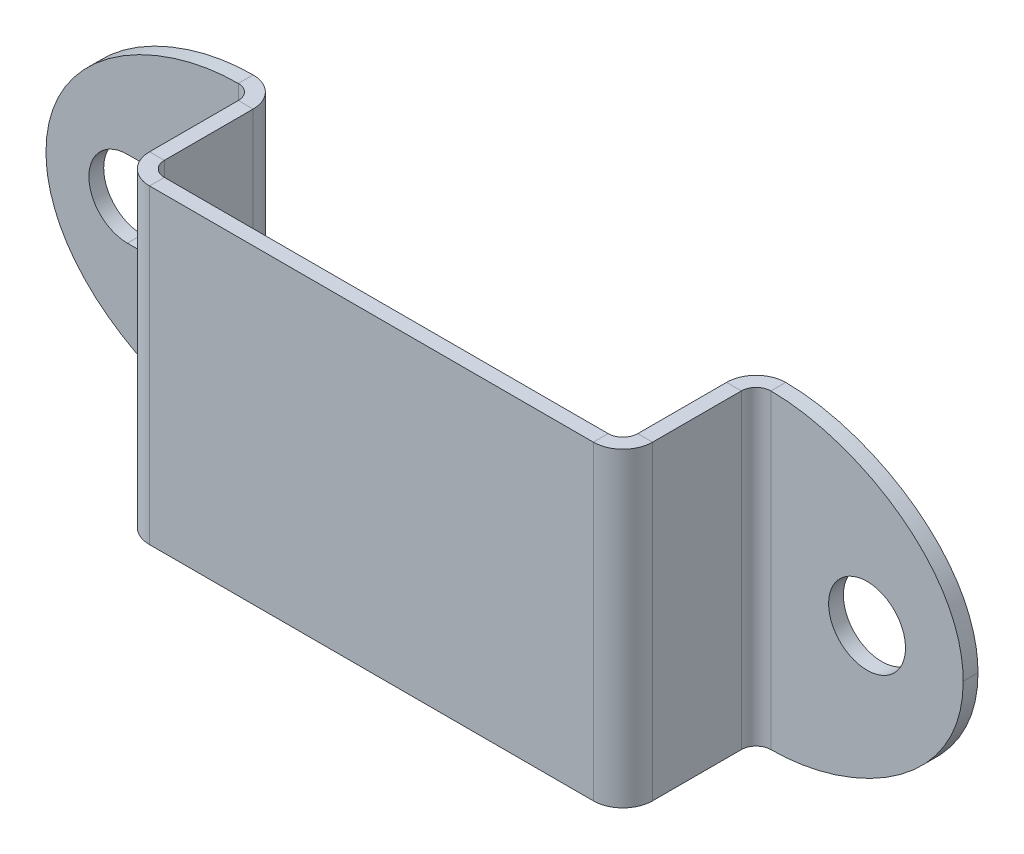
ISO-10303-21;
HEADER;
FILE_DESCRIPTION(('STEP AP214'),'2;1');
FILE_NAME('part.step','',(''),(''),'','','');
FILE_SCHEMA(('AUTOMOTIVE_DESIGN { 1 0 10303 214 1 1 1 1 }'));
ENDSEC;
DATA;
#1=APPLICATION_CONTEXT('core data for automotive mechanical design processes');
#2=APPLICATION_PROTOCOL_DEFINITION('international standard','automotive_design',2000,#1);
#3=PRODUCT_CONTEXT('',#1,'mechanical');
#4=PRODUCT('Part','Part','',(#3));
#5=PRODUCT_RELATED_PRODUCT_CATEGORY('part','',(#4));
#6=PRODUCT_DEFINITION_FORMATION('','',#4);
#7=PRODUCT_DEFINITION_CONTEXT('part definition',#1,'design');
#8=PRODUCT_DEFINITION('design','',#6,#7);
#9=PRODUCT_DEFINITION_SHAPE('','',#8);
#10=(LENGTH_UNIT() NAMED_UNIT(*) SI_UNIT(.MILLI.,.METRE.));
#11=(NAMED_UNIT(*) PLANE_ANGLE_UNIT() SI_UNIT($,.RADIAN.));
#12=(NAMED_UNIT(*) SI_UNIT($,.STERADIAN.) SOLID_ANGLE_UNIT());
#13=UNCERTAINTY_MEASURE_WITH_UNIT(LENGTH_MEASURE(1.E-05),#10,'distance_accuracy_value','');
#14=(GEOMETRIC_REPRESENTATION_CONTEXT(3) GLOBAL_UNCERTAINTY_ASSIGNED_CONTEXT((#13)) GLOBAL_UNIT_ASSIGNED_CONTEXT((#10,
#11,#12)) REPRESENTATION_CONTEXT('',''));
#15=CARTESIAN_POINT('',(0.,0.,0.));
#16=DIRECTION('',(0.,0.,1.));
#17=DIRECTION('',(1.,0.,0.));
#18=AXIS2_PLACEMENT_3D('',#15,#16,#17);
#19=CARTESIAN_POINT('',(16.,21.,1.));
#20=DIRECTION('',(0.,0.,-1.));
#21=DIRECTION('',(-1.,0.,0.));
#22=AXIS2_PLACEMENT_3D('',#19,#20,#21);
#23=PLANE('',#22);
#24=CARTESIAN_POINT('',(24.5,10.5,1.00000000000001));
#25=DIRECTION('',(0.,0.,1.));
#26=DIRECTION('',(-1.,0.,0.));
#27=AXIS2_PLACEMENT_3D('',#24,#25,#26);
#28=CIRCLE('',#27,2.6);
#29=CARTESIAN_POINT('',(21.9,10.5,1.00000000000001));
#30=VERTEX_POINT('',#29);
#31=EDGE_CURVE('E401',#30,#30,#28,.T.);
#32=ORIENTED_EDGE('',*,*,#31,.F.);
#33=EDGE_LOOP('',(#32));
#34=FACE_BOUND('',#33,.T.);
#35=CARTESIAN_POINT('',(18.,21.,1.00000000000001));
#36=CARTESIAN_POINT('',(23.8406079071876,21.,1.00000000000001));
#37=CARTESIAN_POINT('',(31.,16.8315231890879,1.00000000000001));
#38=CARTESIAN_POINT('',(31.,10.5,1.00000000000001));
#39=B_SPLINE_CURVE_WITH_KNOTS('',3,(#35,#36,#37,#38),.UNSPECIFIED.,.F.,.F.,(4,4),(0.,1.),.UNSPECIFIED.);
#40=CARTESIAN_POINT('',(18.,21.,1.00000000000001));
#41=VERTEX_POINT('',#40);
#42=CARTESIAN_POINT('',(31.,10.5,1.00000000000001));
#43=VERTEX_POINT('',#42);
#44=EDGE_CURVE('E202',#41,#43,#39,.T.);
#45=ORIENTED_EDGE('',*,*,#44,.F.);
#46=DIRECTION('',(0.,-1.,0.));
#47=VECTOR('',#46,1.);
#48=CARTESIAN_POINT('',(18.,21.,0.999999999999999));
#49=LINE('',#48,#47);
#50=CARTESIAN_POINT('',(18.,0.,0.999999999999999));
#51=VERTEX_POINT('',#50);
#52=EDGE_CURVE('E217',#41,#51,#49,.T.);
#53=ORIENTED_EDGE('',*,*,#52,.T.);
#54=CARTESIAN_POINT('',(31.,10.5,1.00000000000001));
#55=CARTESIAN_POINT('',(31.,4.16847681091213,1.00000000000001));
#56=CARTESIAN_POINT('',(23.8406079071876,0.,1.00000000000001));
#57=CARTESIAN_POINT('',(18.,0.,1.00000000000001));
#58=B_SPLINE_CURVE_WITH_KNOTS('',3,(#54,#55,#56,#57),.UNSPECIFIED.,.F.,.F.,(4,4),(0.,1.),.UNSPECIFIED.);
#59=EDGE_CURVE('E218',#43,#51,#58,.T.);
#60=ORIENTED_EDGE('',*,*,#59,.F.);
#61=EDGE_LOOP('',(#45,#53,#60));
#62=FACE_BOUND('',#61,.T.);
#63=ADVANCED_FACE('F52',(#34,#62),#23,.F.);
#64=CARTESIAN_POINT('',(16.,21.,0.));
#65=DIRECTION('',(0.,0.,-1.));
#66=DIRECTION('',(-1.,0.,0.));
#67=AXIS2_PLACEMENT_3D('',#64,#65,#66);
#68=PLANE('',#67);
#69=CARTESIAN_POINT('',(24.5,10.5,0.));
#70=DIRECTION('',(0.,0.,1.));
#71=DIRECTION('',(-1.,0.,0.));
#72=AXIS2_PLACEMENT_3D('',#69,#70,#71);
#73=CIRCLE('',#72,2.6);
#74=CARTESIAN_POINT('',(21.9,10.5,0.));
#75=VERTEX_POINT('',#74);
#76=EDGE_CURVE('E356',#75,#75,#73,.T.);
#77=ORIENTED_EDGE('',*,*,#76,.T.);
#78=EDGE_LOOP('',(#77));
#79=FACE_BOUND('',#78,.T.);
#80=DIRECTION('',(0.,-1.,0.));
#81=VECTOR('',#80,1.);
#82=CARTESIAN_POINT('',(18.,21.,0.));
#83=LINE('',#82,#81);
#84=CARTESIAN_POINT('',(18.,21.,0.));
#85=VERTEX_POINT('',#84);
#86=CARTESIAN_POINT('',(18.,0.,0.));
#87=VERTEX_POINT('',#86);
#88=EDGE_CURVE('E277',#85,#87,#83,.T.);
#89=ORIENTED_EDGE('',*,*,#88,.F.);
#90=CARTESIAN_POINT('',(18.,21.,0.));
#91=CARTESIAN_POINT('',(23.8406079071876,21.,0.));
#92=CARTESIAN_POINT('',(31.,16.8315231890879,0.));
#93=CARTESIAN_POINT('',(31.,10.5,0.));
#94=B_SPLINE_CURVE_WITH_KNOTS('',3,(#90,#91,#92,#93),.UNSPECIFIED.,.F.,.F.,(4,4),(0.,1.),.UNSPECIFIED.);
#95=CARTESIAN_POINT('',(31.,10.5,0.));
#96=VERTEX_POINT('',#95);
#97=EDGE_CURVE('E205',#85,#96,#94,.T.);
#98=ORIENTED_EDGE('',*,*,#97,.T.);
#99=CARTESIAN_POINT('',(31.,10.5,0.));
#100=CARTESIAN_POINT('',(31.,4.16847681091213,0.));
#101=CARTESIAN_POINT('',(23.8406079071876,0.,0.));
#102=CARTESIAN_POINT('',(18.,0.,0.));
#103=B_SPLINE_CURVE_WITH_KNOTS('',3,(#99,#100,#101,#102),.UNSPECIFIED.,.F.,.F.,(4,4),(0.,1.),.UNSPECIFIED.);
#104=EDGE_CURVE('E569',#96,#87,#103,.T.);
#105=ORIENTED_EDGE('',*,*,#104,.T.);
#106=EDGE_LOOP('',(#89,#98,#105));
#107=FACE_BOUND('',#106,.T.);
#108=ADVANCED_FACE('F478',(#79,#107),#68,.T.);
#109=CARTESIAN_POINT('',(-31.,21.,0.));
#110=DIRECTION('',(0.,0.,-1.));
#111=DIRECTION('',(-1.,0.,0.));
#112=AXIS2_PLACEMENT_3D('',#109,#110,#111);
#113=PLANE('',#112);
#114=CARTESIAN_POINT('',(-23.5,10.5,0.));
#115=DIRECTION('',(0.,0.,1.));
#116=DIRECTION('',(1.,0.,0.));
#117=AXIS2_PLACEMENT_3D('',#114,#115,#116);
#118=CIRCLE('',#117,2.6);
#119=CARTESIAN_POINT('',(-23.5,7.9,0.));
#120=VERTEX_POINT('',#119);
#121=CARTESIAN_POINT('',(-23.5,13.1,0.));
#122=VERTEX_POINT('',#121);
#123=EDGE_CURVE('E641',#120,#122,#118,.T.);
#124=ORIENTED_EDGE('',*,*,#123,.T.);
#125=DIRECTION('',(-1.,0.,0.));
#126=VECTOR('',#125,1.);
#127=CARTESIAN_POINT('',(-23.5,13.1,0.));
#128=LINE('',#127,#126);
#129=CARTESIAN_POINT('',(-25.5,13.1,0.));
#130=VERTEX_POINT('',#129);
#131=EDGE_CURVE('E644',#122,#130,#128,.T.);
#132=ORIENTED_EDGE('',*,*,#131,.T.);
#133=CARTESIAN_POINT('',(-25.5,10.5,0.));
#134=DIRECTION('',(0.,0.,1.));
#135=DIRECTION('',(1.,0.,0.));
#136=AXIS2_PLACEMENT_3D('',#133,#134,#135);
#137=CIRCLE('',#136,2.6);
#138=CARTESIAN_POINT('',(-25.5,7.9,0.));
#139=VERTEX_POINT('',#138);
#140=EDGE_CURVE('E67',#130,#139,#137,.T.);
#141=ORIENTED_EDGE('',*,*,#140,.T.);
#142=DIRECTION('',(1.,0.,0.));
#143=VECTOR('',#142,1.);
#144=CARTESIAN_POINT('',(-23.5,7.9,0.));
#145=LINE('',#144,#143);
#146=EDGE_CURVE('E649',#139,#120,#145,.T.);
#147=ORIENTED_EDGE('',*,*,#146,.T.);
#148=EDGE_LOOP('',(#124,#132,#141,#147));
#149=FACE_BOUND('',#148,.T.);
#150=CARTESIAN_POINT('',(-18.,0.,0.));
#151=CARTESIAN_POINT('',(-23.8406079071876,0.,0.));
#152=CARTESIAN_POINT('',(-31.,4.16847681091213,0.));
#153=CARTESIAN_POINT('',(-31.,10.5,0.));
#154=B_SPLINE_CURVE_WITH_KNOTS('',3,(#150,#151,#152,#153),.UNSPECIFIED.,.F.,.F.,(4,4),(0.,1.),.UNSPECIFIED.);
#155=CARTESIAN_POINT('',(-18.,0.,0.));
#156=VERTEX_POINT('',#155);
#157=CARTESIAN_POINT('',(-31.,10.5,0.));
#158=VERTEX_POINT('',#157);
#159=EDGE_CURVE('E320',#156,#158,#154,.T.);
#160=ORIENTED_EDGE('',*,*,#159,.T.);
#161=CARTESIAN_POINT('',(-31.,10.5,0.));
#162=CARTESIAN_POINT('',(-31.,16.8315231890879,0.));
#163=CARTESIAN_POINT('',(-23.8406079071876,21.,0.));
#164=CARTESIAN_POINT('',(-18.,21.,0.));
#165=B_SPLINE_CURVE_WITH_KNOTS('',3,(#161,#162,#163,#164),.UNSPECIFIED.,.F.,.F.,(4,4),(0.,1.),.UNSPECIFIED.);
#166=CARTESIAN_POINT('',(-18.,21.,0.));
#167=VERTEX_POINT('',#166);
#168=EDGE_CURVE('E307',#158,#167,#165,.T.);
#169=ORIENTED_EDGE('',*,*,#168,.T.);
#170=DIRECTION('',(0.,-1.,0.));
#171=VECTOR('',#170,1.);
#172=CARTESIAN_POINT('',(-18.,21.,0.));
#173=LINE('',#172,#171);
#174=EDGE_CURVE('E256',#167,#156,#173,.T.);
#175=ORIENTED_EDGE('',*,*,#174,.T.);
#176=EDGE_LOOP('',(#160,#169,#175));
#177=FACE_BOUND('',#176,.T.);
#178=ADVANCED_FACE('F318',(#149,#177),#113,.T.);
#179=CARTESIAN_POINT('',(-31.,21.,1.));
#180=DIRECTION('',(0.,0.,-1.));
#181=DIRECTION('',(-1.,0.,0.));
#182=AXIS2_PLACEMENT_3D('',#179,#180,#181);
#183=PLANE('',#182);
#184=DIRECTION('',(-1.,0.,0.));
#185=VECTOR('',#184,1.);
#186=CARTESIAN_POINT('',(-23.5,13.1,1.00000000000001));
#187=LINE('',#186,#185);
#188=CARTESIAN_POINT('',(-23.5,13.1,1.));
#189=VERTEX_POINT('',#188);
#190=CARTESIAN_POINT('',(-25.5,13.1,1.00000000000001));
#191=VERTEX_POINT('',#190);
#192=EDGE_CURVE('E654',#189,#191,#187,.T.);
#193=ORIENTED_EDGE('',*,*,#192,.F.);
#194=CARTESIAN_POINT('',(-23.5,10.5,1.00000000000001));
#195=DIRECTION('',(0.,0.,1.));
#196=DIRECTION('',(1.,0.,0.));
#197=AXIS2_PLACEMENT_3D('',#194,#195,#196);
#198=CIRCLE('',#197,2.6);
#199=CARTESIAN_POINT('',(-23.5,7.9,1.00000000000001));
#200=VERTEX_POINT('',#199);
#201=EDGE_CURVE('E75',#200,#189,#198,.T.);
#202=ORIENTED_EDGE('',*,*,#201,.F.);
#203=DIRECTION('',(1.,0.,0.));
#204=VECTOR('',#203,1.);
#205=CARTESIAN_POINT('',(-23.5,7.9,1.00000000000001));
#206=LINE('',#205,#204);
#207=CARTESIAN_POINT('',(-25.5,7.9,1.00000000000001));
#208=VERTEX_POINT('',#207);
#209=EDGE_CURVE('E645',#208,#200,#206,.T.);
#210=ORIENTED_EDGE('',*,*,#209,.F.);
#211=CARTESIAN_POINT('',(-25.5,10.5,1.00000000000001));
#212=DIRECTION('',(0.,0.,1.));
#213=DIRECTION('',(1.,0.,0.));
#214=AXIS2_PLACEMENT_3D('',#211,#212,#213);
#215=CIRCLE('',#214,2.6);
#216=EDGE_CURVE('E657',#191,#208,#215,.T.);
#217=ORIENTED_EDGE('',*,*,#216,.F.);
#218=EDGE_LOOP('',(#193,#202,#210,#217));
#219=FACE_BOUND('',#218,.T.);
#220=CARTESIAN_POINT('',(-31.,10.5,1.00000000000001));
#221=CARTESIAN_POINT('',(-31.,16.8315231890879,1.00000000000001));
#222=CARTESIAN_POINT('',(-23.8406079071876,21.,1.00000000000001));
#223=CARTESIAN_POINT('',(-18.,21.,1.00000000000001));
#224=B_SPLINE_CURVE_WITH_KNOTS('',3,(#220,#221,#222,#223),.UNSPECIFIED.,.F.,.F.,(4,4),(0.,1.),.UNSPECIFIED.);
#225=CARTESIAN_POINT('',(-31.,10.5,1.00000000000001));
#226=VERTEX_POINT('',#225);
#227=CARTESIAN_POINT('',(-18.,21.,1.));
#228=VERTEX_POINT('',#227);
#229=EDGE_CURVE('E310',#226,#228,#224,.T.);
#230=ORIENTED_EDGE('',*,*,#229,.F.);
#231=CARTESIAN_POINT('',(-18.,0.,1.00000000000001));
#232=CARTESIAN_POINT('',(-23.8406079071876,0.,1.00000000000001));
#233=CARTESIAN_POINT('',(-31.,4.16847681091213,1.00000000000001));
#234=CARTESIAN_POINT('',(-31.,10.5,1.00000000000001));
#235=B_SPLINE_CURVE_WITH_KNOTS('',3,(#231,#232,#233,#234),.UNSPECIFIED.,.F.,.F.,(4,4),(0.,1.),.UNSPECIFIED.);
#236=CARTESIAN_POINT('',(-18.,0.,1.));
#237=VERTEX_POINT('',#236);
#238=EDGE_CURVE('E460',#237,#226,#235,.T.);
#239=ORIENTED_EDGE('',*,*,#238,.F.);
#240=DIRECTION('',(0.,-1.,0.));
#241=VECTOR('',#240,1.);
#242=CARTESIAN_POINT('',(-18.,21.,1.));
#243=LINE('',#242,#241);
#244=EDGE_CURVE('E253',#228,#237,#243,.T.);
#245=ORIENTED_EDGE('',*,*,#244,.F.);
#246=EDGE_LOOP('',(#230,#239,#245));
#247=FACE_BOUND('',#246,.T.);
#248=ADVANCED_FACE('F462',(#219,#247),#183,.F.);
#249=CARTESIAN_POINT('',(-16.,21.,2.));
#250=DIRECTION('',(0.,1.,0.));
#251=DIRECTION('',(0.,0.,1.));
#252=AXIS2_PLACEMENT_3D('',#249,#250,#251);
#253=PLANE('',#252);
#254=DIRECTION('',(-1.,0.,0.));
#255=VECTOR('',#254,1.);
#256=CARTESIAN_POINT('',(-16.,21.,2.));
#257=LINE('',#256,#255);
#258=CARTESIAN_POINT('',(-16.,21.,2.));
#259=VERTEX_POINT('',#258);
#260=CARTESIAN_POINT('',(-17.,21.,2.));
#261=VERTEX_POINT('',#260);
#262=EDGE_CURVE('E13',#259,#261,#257,.T.);
#263=ORIENTED_EDGE('',*,*,#262,.F.);
#264=CARTESIAN_POINT('',(-18.,21.,2.));
#265=DIRECTION('',(0.,1.,0.));
#266=DIRECTION('',(0.,0.,1.));
#267=AXIS2_PLACEMENT_3D('',#264,#265,#266);
#268=CIRCLE('',#267,2.);
#269=EDGE_CURVE('E326',#167,#259,#268,.F.);
#270=ORIENTED_EDGE('',*,*,#269,.F.);
#271=DIRECTION('',(0.,0.,-1.));
#272=VECTOR('',#271,1.);
#273=CARTESIAN_POINT('',(-18.,21.,1.));
#274=LINE('',#273,#272);
#275=EDGE_CURVE('E60',#228,#167,#274,.T.);
#276=ORIENTED_EDGE('',*,*,#275,.F.);
#277=CARTESIAN_POINT('',(-18.,21.,2.));
#278=DIRECTION('',(0.,1.,0.));
#279=DIRECTION('',(1.,0.,0.));
#280=AXIS2_PLACEMENT_3D('',#277,#278,#279);
#281=CIRCLE('',#280,1.);
#282=EDGE_CURVE('E330',#228,#261,#281,.F.);
#283=ORIENTED_EDGE('',*,*,#282,.T.);
#284=EDGE_LOOP('',(#263,#270,#276,#283));
#285=FACE_BOUND('',#284,.T.);
#286=ADVANCED_FACE('F54',(#285),#253,.T.);
#287=CARTESIAN_POINT('',(-18.,21.,1.));
#288=DIRECTION('',(0.,1.,0.));
#289=DIRECTION('',(0.,0.,1.));
#290=AXIS2_PLACEMENT_3D('',#287,#288,#289);
#291=PLANE('',#290);
#292=DIRECTION('',(0.,0.,1.));
#293=VECTOR('',#292,1.);
#294=CARTESIAN_POINT('',(-16.,21.,0.));
#295=LINE('',#294,#293);
#296=CARTESIAN_POINT('',(-16.,21.,8.00000000000001));
#297=VERTEX_POINT('',#296);
#298=EDGE_CURVE('E331',#259,#297,#295,.T.);
#299=ORIENTED_EDGE('',*,*,#298,.F.);
#300=ORIENTED_EDGE('',*,*,#262,.T.);
#301=DIRECTION('',(0.,0.,-1.));
#302=VECTOR('',#301,1.);
#303=CARTESIAN_POINT('',(-17.,21.,0.));
#304=LINE('',#303,#302);
#305=CARTESIAN_POINT('',(-17.,21.,8.00000000000001));
#306=VERTEX_POINT('',#305);
#307=EDGE_CURVE('E333',#261,#306,#304,.F.);
#308=ORIENTED_EDGE('',*,*,#307,.T.);
#309=DIRECTION('',(1.,0.,0.));
#310=VECTOR('',#309,1.);
#311=CARTESIAN_POINT('',(-17.,21.,8.00000000000001));
#312=LINE('',#311,#310);
#313=EDGE_CURVE('E296',#306,#297,#312,.T.);
#314=ORIENTED_EDGE('',*,*,#313,.T.);
#315=EDGE_LOOP('',(#299,#300,#308,#314));
#316=FACE_BOUND('',#315,.T.);
#317=ADVANCED_FACE('F423',(#316),#291,.T.);
#318=CARTESIAN_POINT('',(-18.,0.,0.));
#319=DIRECTION('',(0.,-1.,0.));
#320=DIRECTION('',(0.,0.,-1.));
#321=AXIS2_PLACEMENT_3D('',#318,#319,#320);
#322=PLANE('',#321);
#323=DIRECTION('',(0.,0.,1.));
#324=VECTOR('',#323,1.);
#325=CARTESIAN_POINT('',(-18.,0.,0.));
#326=LINE('',#325,#324);
#327=EDGE_CURVE('E302',#156,#237,#326,.T.);
#328=ORIENTED_EDGE('',*,*,#327,.F.);
#329=CARTESIAN_POINT('',(-18.,0.,2.));
#330=DIRECTION('',(0.,1.,0.));
#331=DIRECTION('',(0.,0.,1.));
#332=AXIS2_PLACEMENT_3D('',#329,#330,#331);
#333=CIRCLE('',#332,2.);
#334=CARTESIAN_POINT('',(-16.,0.,2.));
#335=VERTEX_POINT('',#334);
#336=EDGE_CURVE('E328',#156,#335,#333,.F.);
#337=ORIENTED_EDGE('',*,*,#336,.T.);
#338=DIRECTION('',(1.,0.,0.));
#339=VECTOR('',#338,1.);
#340=CARTESIAN_POINT('',(-17.,0.,2.));
#341=LINE('',#340,#339);
#342=CARTESIAN_POINT('',(-17.,0.,2.));
#343=VERTEX_POINT('',#342);
#344=EDGE_CURVE('E300',#343,#335,#341,.T.);
#345=ORIENTED_EDGE('',*,*,#344,.F.);
#346=CARTESIAN_POINT('',(-18.,0.,2.));
#347=DIRECTION('',(0.,1.,0.));
#348=DIRECTION('',(1.,0.,0.));
#349=AXIS2_PLACEMENT_3D('',#346,#347,#348);
#350=CIRCLE('',#349,1.);
#351=EDGE_CURVE('E372',#237,#343,#350,.F.);
#352=ORIENTED_EDGE('',*,*,#351,.F.);
#353=EDGE_LOOP('',(#328,#337,#345,#352));
#354=FACE_BOUND('',#353,.T.);
#355=ADVANCED_FACE('F454',(#354),#322,.T.);
#356=CARTESIAN_POINT('',(-15.,21.,9.00000000000001));
#357=DIRECTION('',(0.,1.,0.));
#358=DIRECTION('',(0.,0.,1.));
#359=AXIS2_PLACEMENT_3D('',#356,#357,#358);
#360=PLANE('',#359);
#361=DIRECTION('',(0.,0.,1.));
#362=VECTOR('',#361,1.);
#363=CARTESIAN_POINT('',(-15.,21.,9.00000000000001));
#364=LINE('',#363,#362);
#365=CARTESIAN_POINT('',(-15.,21.,9.00000000000001));
#366=VERTEX_POINT('',#365);
#367=CARTESIAN_POINT('',(-15.,21.,10.));
#368=VERTEX_POINT('',#367);
#369=EDGE_CURVE('E298',#366,#368,#364,.T.);
#370=ORIENTED_EDGE('',*,*,#369,.F.);
#371=CARTESIAN_POINT('',(-15.,21.,8.00000000000001));
#372=DIRECTION('',(0.,-1.,0.));
#373=DIRECTION('',(0.,0.,-1.));
#374=AXIS2_PLACEMENT_3D('',#371,#372,#373);
#375=CIRCLE('',#374,1.);
#376=EDGE_CURVE('E336',#297,#366,#375,.F.);
#377=ORIENTED_EDGE('',*,*,#376,.F.);
#378=ORIENTED_EDGE('',*,*,#313,.F.);
#379=CARTESIAN_POINT('',(-15.,21.,8.00000000000001));
#380=DIRECTION('',(0.,1.,0.));
#381=DIRECTION('',(1.,0.,0.));
#382=AXIS2_PLACEMENT_3D('',#379,#380,#381);
#383=CIRCLE('',#382,2.);
#384=EDGE_CURVE('E342',#306,#368,#383,.T.);
#385=ORIENTED_EDGE('',*,*,#384,.T.);
#386=EDGE_LOOP('',(#370,#377,#378,#385));
#387=FACE_BOUND('',#386,.T.);
#388=ADVANCED_FACE('F417',(#387),#360,.T.);
#389=CARTESIAN_POINT('',(-17.,21.,8.00000000000001));
#390=DIRECTION('',(0.,1.,0.));
#391=DIRECTION('',(0.,0.,1.));
#392=AXIS2_PLACEMENT_3D('',#389,#390,#391);
#393=PLANE('',#392);
#394=DIRECTION('',(1.,0.,0.));
#395=VECTOR('',#394,1.);
#396=CARTESIAN_POINT('',(-16.,21.,9.00000000000001));
#397=LINE('',#396,#395);
#398=CARTESIAN_POINT('',(15.,21.,9.));
#399=VERTEX_POINT('',#398);
#400=EDGE_CURVE('E406',#366,#399,#397,.T.);
#401=ORIENTED_EDGE('',*,*,#400,.F.);
#402=ORIENTED_EDGE('',*,*,#369,.T.);
#403=DIRECTION('',(1.,0.,0.));
#404=VECTOR('',#403,1.);
#405=CARTESIAN_POINT('',(-16.,21.,10.));
#406=LINE('',#405,#404);
#407=CARTESIAN_POINT('',(15.,21.,10.));
#408=VERTEX_POINT('',#407);
#409=EDGE_CURVE('E345',#368,#408,#406,.T.);
#410=ORIENTED_EDGE('',*,*,#409,.T.);
#411=DIRECTION('',(0.,0.,-1.));
#412=VECTOR('',#411,1.);
#413=CARTESIAN_POINT('',(15.,21.,10.));
#414=LINE('',#413,#412);
#415=EDGE_CURVE('E288',#408,#399,#414,.T.);
#416=ORIENTED_EDGE('',*,*,#415,.T.);
#417=EDGE_LOOP('',(#401,#402,#410,#416));
#418=FACE_BOUND('',#417,.T.);
#419=ADVANCED_FACE('F442',(#418),#393,.T.);
#420=CARTESIAN_POINT('',(-16.,0.,8.00000000000001));
#421=DIRECTION('',(0.,-1.,0.));
#422=DIRECTION('',(0.,0.,-1.));
#423=AXIS2_PLACEMENT_3D('',#420,#421,#422);
#424=PLANE('',#423);
#425=DIRECTION('',(-1.,0.,0.));
#426=VECTOR('',#425,1.);
#427=CARTESIAN_POINT('',(-16.,0.,8.00000000000001));
#428=LINE('',#427,#426);
#429=CARTESIAN_POINT('',(-16.,0.,8.00000000000001));
#430=VERTEX_POINT('',#429);
#431=CARTESIAN_POINT('',(-17.,0.,8.00000000000001));
#432=VERTEX_POINT('',#431);
#433=EDGE_CURVE('E294',#430,#432,#428,.T.);
#434=ORIENTED_EDGE('',*,*,#433,.F.);
#435=CARTESIAN_POINT('',(-15.,0.,8.00000000000001));
#436=DIRECTION('',(0.,-1.,0.));
#437=DIRECTION('',(0.,0.,-1.));
#438=AXIS2_PLACEMENT_3D('',#435,#436,#437);
#439=CIRCLE('',#438,1.);
#440=CARTESIAN_POINT('',(-15.,0.,9.00000000000001));
#441=VERTEX_POINT('',#440);
#442=EDGE_CURVE('E365',#430,#441,#439,.F.);
#443=ORIENTED_EDGE('',*,*,#442,.T.);
#444=DIRECTION('',(0.,0.,-1.));
#445=VECTOR('',#444,1.);
#446=CARTESIAN_POINT('',(-15.,0.,10.));
#447=LINE('',#446,#445);
#448=CARTESIAN_POINT('',(-15.,0.,10.));
#449=VERTEX_POINT('',#448);
#450=EDGE_CURVE('E292',#449,#441,#447,.T.);
#451=ORIENTED_EDGE('',*,*,#450,.F.);
#452=CARTESIAN_POINT('',(-15.,0.,8.00000000000001));
#453=DIRECTION('',(0.,1.,0.));
#454=DIRECTION('',(1.,0.,0.));
#455=AXIS2_PLACEMENT_3D('',#452,#453,#454);
#456=CIRCLE('',#455,2.);
#457=EDGE_CURVE('E378',#432,#449,#456,.T.);
#458=ORIENTED_EDGE('',*,*,#457,.F.);
#459=EDGE_LOOP('',(#434,#443,#451,#458));
#460=FACE_BOUND('',#459,.T.);
#461=ADVANCED_FACE('F449',(#460),#424,.T.);
#462=CARTESIAN_POINT('',(-15.,0.,10.));
#463=DIRECTION('',(0.,-1.,0.));
#464=DIRECTION('',(0.,0.,-1.));
#465=AXIS2_PLACEMENT_3D('',#462,#463,#464);
#466=PLANE('',#465);
#467=DIRECTION('',(0.,0.,1.));
#468=VECTOR('',#467,1.);
#469=CARTESIAN_POINT('',(-16.,0.,0.));
#470=LINE('',#469,#468);
#471=EDGE_CURVE('E368',#335,#430,#470,.T.);
#472=ORIENTED_EDGE('',*,*,#471,.T.);
#473=ORIENTED_EDGE('',*,*,#433,.T.);
#474=DIRECTION('',(0.,0.,-1.));
#475=VECTOR('',#474,1.);
#476=CARTESIAN_POINT('',(-17.,0.,0.));
#477=LINE('',#476,#475);
#478=EDGE_CURVE('E375',#343,#432,#477,.F.);
#479=ORIENTED_EDGE('',*,*,#478,.F.);
#480=ORIENTED_EDGE('',*,*,#344,.T.);
#481=EDGE_LOOP('',(#472,#473,#479,#480));
#482=FACE_BOUND('',#481,.T.);
#483=ADVANCED_FACE('F451',(#482),#466,.T.);
#484=CARTESIAN_POINT('',(16.,21.,8.));
#485=DIRECTION('',(0.,1.,0.));
#486=DIRECTION('',(0.,0.,1.));
#487=AXIS2_PLACEMENT_3D('',#484,#485,#486);
#488=PLANE('',#487);
#489=DIRECTION('',(1.,0.,0.));
#490=VECTOR('',#489,1.);
#491=CARTESIAN_POINT('',(16.,21.,8.));
#492=LINE('',#491,#490);
#493=CARTESIAN_POINT('',(16.,21.,8.));
#494=VERTEX_POINT('',#493);
#495=CARTESIAN_POINT('',(17.,21.,8.));
#496=VERTEX_POINT('',#495);
#497=EDGE_CURVE('E290',#494,#496,#492,.T.);
#498=ORIENTED_EDGE('',*,*,#497,.F.);
#499=CARTESIAN_POINT('',(15.,21.,8.));
#500=DIRECTION('',(0.,-1.,0.));
#501=DIRECTION('',(0.,0.,-1.));
#502=AXIS2_PLACEMENT_3D('',#499,#500,#501);
#503=CIRCLE('',#502,1.);
#504=EDGE_CURVE('E398',#399,#494,#503,.F.);
#505=ORIENTED_EDGE('',*,*,#504,.F.);
#506=ORIENTED_EDGE('',*,*,#415,.F.);
#507=CARTESIAN_POINT('',(15.,21.,8.));
#508=DIRECTION('',(0.,1.,0.));
#509=DIRECTION('',(1.,0.,0.));
#510=AXIS2_PLACEMENT_3D('',#507,#508,#509);
#511=CIRCLE('',#510,2.);
#512=EDGE_CURVE('E348',#408,#496,#511,.T.);
#513=ORIENTED_EDGE('',*,*,#512,.T.);
#514=EDGE_LOOP('',(#498,#505,#506,#513));
#515=FACE_BOUND('',#514,.T.);
#516=ADVANCED_FACE('F510',(#515),#488,.T.);
#517=CARTESIAN_POINT('',(15.,21.,10.));
#518=DIRECTION('',(0.,1.,0.));
#519=DIRECTION('',(0.,0.,1.));
#520=AXIS2_PLACEMENT_3D('',#517,#518,#519);
#521=PLANE('',#520);
#522=DIRECTION('',(0.,0.,-1.));
#523=VECTOR('',#522,1.);
#524=CARTESIAN_POINT('',(16.,21.,9.));
#525=LINE('',#524,#523);
#526=CARTESIAN_POINT('',(16.,21.,2.));
#527=VERTEX_POINT('',#526);
#528=EDGE_CURVE('E393',#494,#527,#525,.T.);
#529=ORIENTED_EDGE('',*,*,#528,.F.);
#530=ORIENTED_EDGE('',*,*,#497,.T.);
#531=DIRECTION('',(0.,0.,-1.));
#532=VECTOR('',#531,1.);
#533=CARTESIAN_POINT('',(17.,21.,9.));
#534=LINE('',#533,#532);
#535=CARTESIAN_POINT('',(17.,21.,2.));
#536=VERTEX_POINT('',#535);
#537=EDGE_CURVE('E226',#496,#536,#534,.T.);
#538=ORIENTED_EDGE('',*,*,#537,.T.);
#539=DIRECTION('',(-1.,0.,0.));
#540=VECTOR('',#539,1.);
#541=CARTESIAN_POINT('',(17.,21.,2.));
#542=LINE('',#541,#540);
#543=EDGE_CURVE('E211',#536,#527,#542,.T.);
#544=ORIENTED_EDGE('',*,*,#543,.T.);
#545=EDGE_LOOP('',(#529,#530,#538,#544));
#546=FACE_BOUND('',#545,.T.);
#547=ADVANCED_FACE('F506',(#546),#521,.T.);
#548=CARTESIAN_POINT('',(15.,0.,9.));
#549=DIRECTION('',(0.,-1.,0.));
#550=DIRECTION('',(0.,0.,-1.));
#551=AXIS2_PLACEMENT_3D('',#548,#549,#550);
#552=PLANE('',#551);
#553=DIRECTION('',(0.,0.,1.));
#554=VECTOR('',#553,1.);
#555=CARTESIAN_POINT('',(15.,0.,9.));
#556=LINE('',#555,#554);
#557=CARTESIAN_POINT('',(15.,0.,9.));
#558=VERTEX_POINT('',#557);
#559=CARTESIAN_POINT('',(15.,0.,10.));
#560=VERTEX_POINT('',#559);
#561=EDGE_CURVE('E286',#558,#560,#556,.T.);
#562=ORIENTED_EDGE('',*,*,#561,.F.);
#563=CARTESIAN_POINT('',(15.,0.,8.));
#564=DIRECTION('',(0.,-1.,0.));
#565=DIRECTION('',(0.,0.,-1.));
#566=AXIS2_PLACEMENT_3D('',#563,#564,#565);
#567=CIRCLE('',#566,1.);
#568=CARTESIAN_POINT('',(16.,0.,8.));
#569=VERTEX_POINT('',#568);
#570=EDGE_CURVE('E359',#558,#569,#567,.F.);
#571=ORIENTED_EDGE('',*,*,#570,.T.);
#572=DIRECTION('',(-1.,0.,0.));
#573=VECTOR('',#572,1.);
#574=CARTESIAN_POINT('',(17.,0.,8.));
#575=LINE('',#574,#573);
#576=CARTESIAN_POINT('',(17.,0.,8.));
#577=VERTEX_POINT('',#576);
#578=EDGE_CURVE('E210',#577,#569,#575,.T.);
#579=ORIENTED_EDGE('',*,*,#578,.F.);
#580=CARTESIAN_POINT('',(15.,0.,8.));
#581=DIRECTION('',(0.,1.,0.));
#582=DIRECTION('',(1.,0.,0.));
#583=AXIS2_PLACEMENT_3D('',#580,#581,#582);
#584=CIRCLE('',#583,2.);
#585=EDGE_CURVE('E384',#560,#577,#584,.T.);
#586=ORIENTED_EDGE('',*,*,#585,.F.);
#587=EDGE_LOOP('',(#562,#571,#579,#586));
#588=FACE_BOUND('',#587,.T.);
#589=ADVANCED_FACE('F503',(#588),#552,.T.);
#590=CARTESIAN_POINT('',(17.,0.,8.));
#591=DIRECTION('',(0.,-1.,0.));
#592=DIRECTION('',(0.,0.,-1.));
#593=AXIS2_PLACEMENT_3D('',#590,#591,#592);
#594=PLANE('',#593);
#595=DIRECTION('',(1.,0.,0.));
#596=VECTOR('',#595,1.);
#597=CARTESIAN_POINT('',(-16.,0.,9.00000000000001));
#598=LINE('',#597,#596);
#599=EDGE_CURVE('E362',#441,#558,#598,.T.);
#600=ORIENTED_EDGE('',*,*,#599,.T.);
#601=ORIENTED_EDGE('',*,*,#561,.T.);
#602=DIRECTION('',(1.,0.,0.));
#603=VECTOR('',#602,1.);
#604=CARTESIAN_POINT('',(-16.,0.,10.));
#605=LINE('',#604,#603);
#606=EDGE_CURVE('E381',#449,#560,#605,.T.);
#607=ORIENTED_EDGE('',*,*,#606,.F.);
#608=ORIENTED_EDGE('',*,*,#450,.T.);
#609=EDGE_LOOP('',(#600,#601,#607,#608));
#610=FACE_BOUND('',#609,.T.);
#611=ADVANCED_FACE('F500',(#610),#594,.T.);
#612=CARTESIAN_POINT('',(18.,21.,0.));
#613=DIRECTION('',(0.,1.,0.));
#614=DIRECTION('',(0.,0.,1.));
#615=AXIS2_PLACEMENT_3D('',#612,#613,#614);
#616=PLANE('',#615);
#617=DIRECTION('',(0.,0.,1.));
#618=VECTOR('',#617,1.);
#619=CARTESIAN_POINT('',(18.,21.,0.));
#620=LINE('',#619,#618);
#621=EDGE_CURVE('E199',#85,#41,#620,.T.);
#622=ORIENTED_EDGE('',*,*,#621,.F.);
#623=CARTESIAN_POINT('',(18.,21.,2.));
#624=DIRECTION('',(0.,1.,0.));
#625=DIRECTION('',(0.,0.,1.));
#626=AXIS2_PLACEMENT_3D('',#623,#624,#625);
#627=CIRCLE('',#626,2.);
#628=EDGE_CURVE('E391',#527,#85,#627,.F.);
#629=ORIENTED_EDGE('',*,*,#628,.F.);
#630=ORIENTED_EDGE('',*,*,#543,.F.);
#631=CARTESIAN_POINT('',(18.,21.,2.));
#632=DIRECTION('',(0.,1.,0.));
#633=DIRECTION('',(1.,0.,0.));
#634=AXIS2_PLACEMENT_3D('',#631,#632,#633);
#635=CIRCLE('',#634,1.);
#636=EDGE_CURVE('E221',#536,#41,#635,.F.);
#637=ORIENTED_EDGE('',*,*,#636,.T.);
#638=EDGE_LOOP('',(#622,#629,#630,#637));
#639=FACE_BOUND('',#638,.T.);
#640=ADVANCED_FACE('F222',(#639),#616,.T.);
#641=CARTESIAN_POINT('',(16.,0.,2.));
#642=DIRECTION('',(0.,-1.,0.));
#643=DIRECTION('',(0.,0.,-1.));
#644=AXIS2_PLACEMENT_3D('',#641,#642,#643);
#645=PLANE('',#644);
#646=DIRECTION('',(1.,0.,0.));
#647=VECTOR('',#646,1.);
#648=CARTESIAN_POINT('',(16.,0.,2.));
#649=LINE('',#648,#647);
#650=CARTESIAN_POINT('',(16.,0.,2.));
#651=VERTEX_POINT('',#650);
#652=CARTESIAN_POINT('',(17.,0.,2.));
#653=VERTEX_POINT('',#652);
#654=EDGE_CURVE('E282',#651,#653,#649,.T.);
#655=ORIENTED_EDGE('',*,*,#654,.F.);
#656=CARTESIAN_POINT('',(18.,0.,2.));
#657=DIRECTION('',(0.,1.,0.));
#658=DIRECTION('',(0.,0.,1.));
#659=AXIS2_PLACEMENT_3D('',#656,#657,#658);
#660=CIRCLE('',#659,2.);
#661=EDGE_CURVE('E352',#651,#87,#660,.F.);
#662=ORIENTED_EDGE('',*,*,#661,.T.);
#663=DIRECTION('',(0.,0.,-1.));
#664=VECTOR('',#663,1.);
#665=CARTESIAN_POINT('',(18.,0.,0.999999999999999));
#666=LINE('',#665,#664);
#667=EDGE_CURVE('E280',#51,#87,#666,.T.);
#668=ORIENTED_EDGE('',*,*,#667,.F.);
#669=CARTESIAN_POINT('',(18.,0.,2.));
#670=DIRECTION('',(0.,1.,0.));
#671=DIRECTION('',(1.,0.,0.));
#672=AXIS2_PLACEMENT_3D('',#669,#670,#671);
#673=CIRCLE('',#672,1.);
#674=EDGE_CURVE('E231',#653,#51,#673,.F.);
#675=ORIENTED_EDGE('',*,*,#674,.F.);
#676=EDGE_LOOP('',(#655,#662,#668,#675));
#677=FACE_BOUND('',#676,.T.);
#678=ADVANCED_FACE('F493',(#677),#645,.T.);
#679=CARTESIAN_POINT('',(18.,0.,0.999999999999999));
#680=DIRECTION('',(0.,-1.,0.));
#681=DIRECTION('',(0.,0.,-1.));
#682=AXIS2_PLACEMENT_3D('',#679,#680,#681);
#683=PLANE('',#682);
#684=DIRECTION('',(0.,0.,-1.));
#685=VECTOR('',#684,1.);
#686=CARTESIAN_POINT('',(16.,0.,9.));
#687=LINE('',#686,#685);
#688=EDGE_CURVE('E355',#569,#651,#687,.T.);
#689=ORIENTED_EDGE('',*,*,#688,.T.);
#690=ORIENTED_EDGE('',*,*,#654,.T.);
#691=DIRECTION('',(0.,0.,-1.));
#692=VECTOR('',#691,1.);
#693=CARTESIAN_POINT('',(17.,0.,9.));
#694=LINE('',#693,#692);
#695=EDGE_CURVE('E386',#577,#653,#694,.T.);
#696=ORIENTED_EDGE('',*,*,#695,.F.);
#697=ORIENTED_EDGE('',*,*,#578,.T.);
#698=EDGE_LOOP('',(#689,#690,#696,#697));
#699=FACE_BOUND('',#698,.T.);
#700=ADVANCED_FACE('F489',(#699),#683,.T.);
#701=CARTESIAN_POINT('',(18.,21.,2.));
#702=DIRECTION('',(0.,-1.,0.));
#703=DIRECTION('',(0.,0.,-1.));
#704=AXIS2_PLACEMENT_3D('',#701,#702,#703);
#705=CYLINDRICAL_SURFACE('',#704,2.);
#706=ORIENTED_EDGE('',*,*,#661,.F.);
#707=DIRECTION('',(0.,-1.,0.));
#708=VECTOR('',#707,1.);
#709=CARTESIAN_POINT('',(16.,21.,2.));
#710=LINE('',#709,#708);
#711=EDGE_CURVE('E274',#527,#651,#710,.T.);
#712=ORIENTED_EDGE('',*,*,#711,.F.);
#713=ORIENTED_EDGE('',*,*,#628,.T.);
#714=ORIENTED_EDGE('',*,*,#88,.T.);
#715=EDGE_LOOP('',(#706,#712,#713,#714));
#716=FACE_BOUND('',#715,.T.);
#717=ADVANCED_FACE('F492',(#716),#705,.T.);
#718=CARTESIAN_POINT('',(16.,21.,9.));
#719=DIRECTION('',(-1.,0.,0.));
#720=DIRECTION('',(0.,0.,1.));
#721=AXIS2_PLACEMENT_3D('',#718,#719,#720);
#722=PLANE('',#721);
#723=ORIENTED_EDGE('',*,*,#688,.F.);
#724=DIRECTION('',(0.,-1.,0.));
#725=VECTOR('',#724,1.);
#726=CARTESIAN_POINT('',(16.,21.,8.));
#727=LINE('',#726,#725);
#728=EDGE_CURVE('E271',#494,#569,#727,.T.);
#729=ORIENTED_EDGE('',*,*,#728,.F.);
#730=ORIENTED_EDGE('',*,*,#528,.T.);
#731=ORIENTED_EDGE('',*,*,#711,.T.);
#732=EDGE_LOOP('',(#723,#729,#730,#731));
#733=FACE_BOUND('',#732,.T.);
#734=ADVANCED_FACE('F548',(#733),#722,.T.);
#735=CARTESIAN_POINT('',(15.,21.,8.));
#736=DIRECTION('',(0.,-1.,0.));
#737=DIRECTION('',(0.,0.,-1.));
#738=AXIS2_PLACEMENT_3D('',#735,#736,#737);
#739=CYLINDRICAL_SURFACE('',#738,1.);
#740=ORIENTED_EDGE('',*,*,#570,.F.);
#741=DIRECTION('',(0.,-1.,0.));
#742=VECTOR('',#741,1.);
#743=CARTESIAN_POINT('',(15.,21.,9.));
#744=LINE('',#743,#742);
#745=EDGE_CURVE('E268',#399,#558,#744,.T.);
#746=ORIENTED_EDGE('',*,*,#745,.F.);
#747=ORIENTED_EDGE('',*,*,#504,.T.);
#748=ORIENTED_EDGE('',*,*,#728,.T.);
#749=EDGE_LOOP('',(#740,#746,#747,#748));
#750=FACE_BOUND('',#749,.T.);
#751=ADVANCED_FACE('F545',(#750),#739,.F.);
#752=CARTESIAN_POINT('',(-16.,21.,9.00000000000001));
#753=DIRECTION('',(0.,0.,-1.));
#754=DIRECTION('',(-1.,0.,0.));
#755=AXIS2_PLACEMENT_3D('',#752,#753,#754);
#756=PLANE('',#755);
#757=ORIENTED_EDGE('',*,*,#599,.F.);
#758=DIRECTION('',(0.,-1.,0.));
#759=VECTOR('',#758,1.);
#760=CARTESIAN_POINT('',(-15.,21.,9.00000000000001));
#761=LINE('',#760,#759);
#762=EDGE_CURVE('E265',#366,#441,#761,.T.);
#763=ORIENTED_EDGE('',*,*,#762,.F.);
#764=ORIENTED_EDGE('',*,*,#400,.T.);
#765=ORIENTED_EDGE('',*,*,#745,.T.);
#766=EDGE_LOOP('',(#757,#763,#764,#765));
#767=FACE_BOUND('',#766,.T.);
#768=ADVANCED_FACE('F445',(#767),#756,.T.);
#769=CARTESIAN_POINT('',(-15.,21.,8.00000000000001));
#770=DIRECTION('',(0.,-1.,0.));
#771=DIRECTION('',(0.,0.,-1.));
#772=AXIS2_PLACEMENT_3D('',#769,#770,#771);
#773=CYLINDRICAL_SURFACE('',#772,1.);
#774=ORIENTED_EDGE('',*,*,#442,.F.);
#775=DIRECTION('',(0.,-1.,0.));
#776=VECTOR('',#775,1.);
#777=CARTESIAN_POINT('',(-16.,21.,8.00000000000001));
#778=LINE('',#777,#776);
#779=EDGE_CURVE('E262',#297,#430,#778,.T.);
#780=ORIENTED_EDGE('',*,*,#779,.F.);
#781=ORIENTED_EDGE('',*,*,#376,.T.);
#782=ORIENTED_EDGE('',*,*,#762,.T.);
#783=EDGE_LOOP('',(#774,#780,#781,#782));
#784=FACE_BOUND('',#783,.T.);
#785=ADVANCED_FACE('F413',(#784),#773,.F.);
#786=CARTESIAN_POINT('',(-16.,21.,0.));
#787=DIRECTION('',(1.,0.,0.));
#788=DIRECTION('',(0.,0.,-1.));
#789=AXIS2_PLACEMENT_3D('',#786,#787,#788);
#790=PLANE('',#789);
#791=ORIENTED_EDGE('',*,*,#471,.F.);
#792=DIRECTION('',(0.,-1.,0.));
#793=VECTOR('',#792,1.);
#794=CARTESIAN_POINT('',(-16.,21.,2.));
#795=LINE('',#794,#793);
#796=EDGE_CURVE('E259',#259,#335,#795,.T.);
#797=ORIENTED_EDGE('',*,*,#796,.F.);
#798=ORIENTED_EDGE('',*,*,#298,.T.);
#799=ORIENTED_EDGE('',*,*,#779,.T.);
#800=EDGE_LOOP('',(#791,#797,#798,#799));
#801=FACE_BOUND('',#800,.T.);
#802=ADVANCED_FACE('F421',(#801),#790,.T.);
#803=CARTESIAN_POINT('',(-18.,21.,2.));
#804=DIRECTION('',(0.,-1.,0.));
#805=DIRECTION('',(0.,0.,-1.));
#806=AXIS2_PLACEMENT_3D('',#803,#804,#805);
#807=CYLINDRICAL_SURFACE('',#806,2.);
#808=ORIENTED_EDGE('',*,*,#336,.F.);
#809=ORIENTED_EDGE('',*,*,#174,.F.);
#810=ORIENTED_EDGE('',*,*,#269,.T.);
#811=ORIENTED_EDGE('',*,*,#796,.T.);
#812=EDGE_LOOP('',(#808,#809,#810,#811));
#813=FACE_BOUND('',#812,.T.);
#814=ADVANCED_FACE('F325',(#813),#807,.T.);
#815=CARTESIAN_POINT('',(-18.,21.,2.));
#816=DIRECTION('',(0.,-1.,0.));
#817=DIRECTION('',(0.,0.,-1.));
#818=AXIS2_PLACEMENT_3D('',#815,#816,#817);
#819=CYLINDRICAL_SURFACE('',#818,1.);
#820=ORIENTED_EDGE('',*,*,#351,.T.);
#821=DIRECTION('',(0.,-1.,0.));
#822=VECTOR('',#821,1.);
#823=CARTESIAN_POINT('',(-17.,21.,2.));
#824=LINE('',#823,#822);
#825=EDGE_CURVE('E250',#261,#343,#824,.T.);
#826=ORIENTED_EDGE('',*,*,#825,.F.);
#827=ORIENTED_EDGE('',*,*,#282,.F.);
#828=ORIENTED_EDGE('',*,*,#244,.T.);
#829=EDGE_LOOP('',(#820,#826,#827,#828));
#830=FACE_BOUND('',#829,.T.);
#831=ADVANCED_FACE('F466',(#830),#819,.F.);
#832=CARTESIAN_POINT('',(-17.,21.,0.));
#833=DIRECTION('',(1.,0.,0.));
#834=DIRECTION('',(0.,0.,-1.));
#835=AXIS2_PLACEMENT_3D('',#832,#833,#834);
#836=PLANE('',#835);
#837=ORIENTED_EDGE('',*,*,#478,.T.);
#838=DIRECTION('',(0.,-1.,0.));
#839=VECTOR('',#838,1.);
#840=CARTESIAN_POINT('',(-17.,21.,8.00000000000001));
#841=LINE('',#840,#839);
#842=EDGE_CURVE('E247',#306,#432,#841,.T.);
#843=ORIENTED_EDGE('',*,*,#842,.F.);
#844=ORIENTED_EDGE('',*,*,#307,.F.);
#845=ORIENTED_EDGE('',*,*,#825,.T.);
#846=EDGE_LOOP('',(#837,#843,#844,#845));
#847=FACE_BOUND('',#846,.T.);
#848=ADVANCED_FACE('F428',(#847),#836,.F.);
#849=CARTESIAN_POINT('',(-15.,21.,8.00000000000001));
#850=DIRECTION('',(0.,-1.,0.));
#851=DIRECTION('',(0.,0.,-1.));
#852=AXIS2_PLACEMENT_3D('',#849,#850,#851);
#853=CYLINDRICAL_SURFACE('',#852,2.);
#854=ORIENTED_EDGE('',*,*,#457,.T.);
#855=DIRECTION('',(0.,-1.,0.));
#856=VECTOR('',#855,1.);
#857=CARTESIAN_POINT('',(-15.,21.,10.));
#858=LINE('',#857,#856);
#859=EDGE_CURVE('E244',#368,#449,#858,.T.);
#860=ORIENTED_EDGE('',*,*,#859,.F.);
#861=ORIENTED_EDGE('',*,*,#384,.F.);
#862=ORIENTED_EDGE('',*,*,#842,.T.);
#863=EDGE_LOOP('',(#854,#860,#861,#862));
#864=FACE_BOUND('',#863,.T.);
#865=ADVANCED_FACE('F433',(#864),#853,.T.);
#866=CARTESIAN_POINT('',(-16.,21.,10.));
#867=DIRECTION('',(0.,0.,-1.));
#868=DIRECTION('',(-1.,0.,0.));
#869=AXIS2_PLACEMENT_3D('',#866,#867,#868);
#870=PLANE('',#869);
#871=ORIENTED_EDGE('',*,*,#606,.T.);
#872=DIRECTION('',(0.,-1.,0.));
#873=VECTOR('',#872,1.);
#874=CARTESIAN_POINT('',(15.,21.,10.));
#875=LINE('',#874,#873);
#876=EDGE_CURVE('E241',#408,#560,#875,.T.);
#877=ORIENTED_EDGE('',*,*,#876,.F.);
#878=ORIENTED_EDGE('',*,*,#409,.F.);
#879=ORIENTED_EDGE('',*,*,#859,.T.);
#880=EDGE_LOOP('',(#871,#877,#878,#879));
#881=FACE_BOUND('',#880,.T.);
#882=ADVANCED_FACE('F438',(#881),#870,.F.);
#883=CARTESIAN_POINT('',(15.,21.,8.));
#884=DIRECTION('',(0.,-1.,0.));
#885=DIRECTION('',(0.,0.,-1.));
#886=AXIS2_PLACEMENT_3D('',#883,#884,#885);
#887=CYLINDRICAL_SURFACE('',#886,2.);
#888=ORIENTED_EDGE('',*,*,#585,.T.);
#889=DIRECTION('',(0.,-1.,0.));
#890=VECTOR('',#889,1.);
#891=CARTESIAN_POINT('',(17.,21.,8.));
#892=LINE('',#891,#890);
#893=EDGE_CURVE('E234',#496,#577,#892,.T.);
#894=ORIENTED_EDGE('',*,*,#893,.F.);
#895=ORIENTED_EDGE('',*,*,#512,.F.);
#896=ORIENTED_EDGE('',*,*,#876,.T.);
#897=EDGE_LOOP('',(#888,#894,#895,#896));
#898=FACE_BOUND('',#897,.T.);
#899=ADVANCED_FACE('F688',(#898),#887,.T.);
#900=CARTESIAN_POINT('',(17.,21.,9.));
#901=DIRECTION('',(-1.,0.,0.));
#902=DIRECTION('',(0.,0.,1.));
#903=AXIS2_PLACEMENT_3D('',#900,#901,#902);
#904=PLANE('',#903);
#905=ORIENTED_EDGE('',*,*,#695,.T.);
#906=DIRECTION('',(0.,-1.,0.));
#907=VECTOR('',#906,1.);
#908=CARTESIAN_POINT('',(17.,21.,2.));
#909=LINE('',#908,#907);
#910=EDGE_CURVE('E232',#536,#653,#909,.T.);
#911=ORIENTED_EDGE('',*,*,#910,.F.);
#912=ORIENTED_EDGE('',*,*,#537,.F.);
#913=ORIENTED_EDGE('',*,*,#893,.T.);
#914=EDGE_LOOP('',(#905,#911,#912,#913));
#915=FACE_BOUND('',#914,.T.);
#916=ADVANCED_FACE('F564',(#915),#904,.F.);
#917=CARTESIAN_POINT('',(18.,21.,2.));
#918=DIRECTION('',(0.,-1.,0.));
#919=DIRECTION('',(0.,0.,-1.));
#920=AXIS2_PLACEMENT_3D('',#917,#918,#919);
#921=CYLINDRICAL_SURFACE('',#920,1.);
#922=ORIENTED_EDGE('',*,*,#674,.T.);
#923=ORIENTED_EDGE('',*,*,#52,.F.);
#924=ORIENTED_EDGE('',*,*,#636,.F.);
#925=ORIENTED_EDGE('',*,*,#910,.T.);
#926=EDGE_LOOP('',(#922,#923,#924,#925));
#927=FACE_BOUND('',#926,.T.);
#928=ADVANCED_FACE('F229',(#927),#921,.F.);
#929=CARTESIAN_POINT('',(24.5,10.5,0.));
#930=DIRECTION('',(0.,0.,1.));
#931=DIRECTION('',(1.,0.,0.));
#932=AXIS2_PLACEMENT_3D('',#929,#930,#931);
#933=CYLINDRICAL_SURFACE('',#932,2.6);
#934=ORIENTED_EDGE('',*,*,#76,.F.);
#935=EDGE_LOOP('',(#934));
#936=FACE_BOUND('',#935,.T.);
#937=ORIENTED_EDGE('',*,*,#31,.T.);
#938=EDGE_LOOP('',(#937));
#939=FACE_BOUND('',#938,.T.);
#940=ADVANCED_FACE('F672',(#936,#939),#933,.F.);
#941=CARTESIAN_POINT('',(-23.5,10.5,0.));
#942=DIRECTION('',(0.,0.,1.));
#943=DIRECTION('',(1.,0.,0.));
#944=AXIS2_PLACEMENT_3D('',#941,#942,#943);
#945=CYLINDRICAL_SURFACE('',#944,2.6);
#946=ORIENTED_EDGE('',*,*,#201,.T.);
#947=DIRECTION('',(0.,0.,1.));
#948=VECTOR('',#947,1.);
#949=CARTESIAN_POINT('',(-23.5,13.1,0.));
#950=LINE('',#949,#948);
#951=EDGE_CURVE('E652',#122,#189,#950,.T.);
#952=ORIENTED_EDGE('',*,*,#951,.F.);
#953=ORIENTED_EDGE('',*,*,#123,.F.);
#954=DIRECTION('',(0.,0.,1.));
#955=VECTOR('',#954,1.);
#956=CARTESIAN_POINT('',(-23.5,7.9,0.));
#957=LINE('',#956,#955);
#958=EDGE_CURVE('E662',#120,#200,#957,.T.);
#959=ORIENTED_EDGE('',*,*,#958,.T.);
#960=EDGE_LOOP('',(#946,#952,#953,#959));
#961=FACE_BOUND('',#960,.T.);
#962=ADVANCED_FACE('F674',(#961),#945,.F.);
#963=CARTESIAN_POINT('',(-23.5,7.9,0.));
#964=DIRECTION('',(0.,-1.,0.));
#965=DIRECTION('',(0.,0.,-1.));
#966=AXIS2_PLACEMENT_3D('',#963,#964,#965);
#967=PLANE('',#966);
#968=ORIENTED_EDGE('',*,*,#209,.T.);
#969=ORIENTED_EDGE('',*,*,#958,.F.);
#970=ORIENTED_EDGE('',*,*,#146,.F.);
#971=DIRECTION('',(0.,0.,1.));
#972=VECTOR('',#971,1.);
#973=CARTESIAN_POINT('',(-25.5,7.9,0.));
#974=LINE('',#973,#972);
#975=EDGE_CURVE('E664',#139,#208,#974,.T.);
#976=ORIENTED_EDGE('',*,*,#975,.T.);
#977=EDGE_LOOP('',(#968,#969,#970,#976));
#978=FACE_BOUND('',#977,.T.);
#979=ADVANCED_FACE('F681',(#978),#967,.F.);
#980=CARTESIAN_POINT('',(-25.5,10.5,0.));
#981=DIRECTION('',(0.,0.,1.));
#982=DIRECTION('',(1.,0.,0.));
#983=AXIS2_PLACEMENT_3D('',#980,#981,#982);
#984=CYLINDRICAL_SURFACE('',#983,2.6);
#985=ORIENTED_EDGE('',*,*,#216,.T.);
#986=ORIENTED_EDGE('',*,*,#975,.F.);
#987=ORIENTED_EDGE('',*,*,#140,.F.);
#988=DIRECTION('',(0.,0.,1.));
#989=VECTOR('',#988,1.);
#990=CARTESIAN_POINT('',(-25.5,13.1,0.));
#991=LINE('',#990,#989);
#992=EDGE_CURVE('E666',#130,#191,#991,.T.);
#993=ORIENTED_EDGE('',*,*,#992,.T.);
#994=EDGE_LOOP('',(#985,#986,#987,#993));
#995=FACE_BOUND('',#994,.T.);
#996=ADVANCED_FACE('F786',(#995),#984,.F.);
#997=CARTESIAN_POINT('',(-23.5,13.1,0.));
#998=DIRECTION('',(0.,1.,0.));
#999=DIRECTION('',(0.,0.,1.));
#1000=AXIS2_PLACEMENT_3D('',#997,#998,#999);
#1001=PLANE('',#1000);
#1002=ORIENTED_EDGE('',*,*,#192,.T.);
#1003=ORIENTED_EDGE('',*,*,#992,.F.);
#1004=ORIENTED_EDGE('',*,*,#131,.F.);
#1005=ORIENTED_EDGE('',*,*,#951,.T.);
#1006=EDGE_LOOP('',(#1002,#1003,#1004,#1005));
#1007=FACE_BOUND('',#1006,.T.);
#1008=ADVANCED_FACE('F729',(#1007),#1001,.F.);
#1009=CARTESIAN_POINT('',(-18.,0.,1.00000000000001));
#1010=CARTESIAN_POINT('',(-23.8406079071876,0.,1.00000000000001));
#1011=CARTESIAN_POINT('',(-31.,4.16847681091213,1.00000000000001));
#1012=CARTESIAN_POINT('',(-31.,10.5,1.00000000000001));
#1013=B_SPLINE_CURVE_WITH_KNOTS('',3,(#1009,#1010,#1011,#1012),.UNSPECIFIED.,.F.,.F.,(4,4),(0.,
1.),.UNSPECIFIED.);
#1014=DIRECTION('',(0.,0.,-1.));
#1015=VECTOR('',#1014,1.);
#1016=SURFACE_OF_LINEAR_EXTRUSION('',#1013,#1015);
#1017=ORIENTED_EDGE('',*,*,#327,.T.);
#1018=ORIENTED_EDGE('',*,*,#238,.T.);
#1019=DIRECTION('',(0.,0.,1.));
#1020=VECTOR('',#1019,1.);
#1021=CARTESIAN_POINT('',(-31.,10.5,1.));
#1022=LINE('',#1021,#1020);
#1023=EDGE_CURVE('E624',#226,#158,#1022,.F.);
#1024=ORIENTED_EDGE('',*,*,#1023,.T.);
#1025=ORIENTED_EDGE('',*,*,#159,.F.);
#1026=EDGE_LOOP('',(#1017,#1018,#1024,#1025));
#1027=FACE_BOUND('',#1026,.T.);
#1028=ADVANCED_FACE('F459',(#1027),#1016,.T.);
#1029=CARTESIAN_POINT('',(-31.,10.5,1.00000000000001));
#1030=CARTESIAN_POINT('',(-31.,16.8315231890879,1.00000000000001));
#1031=CARTESIAN_POINT('',(-23.8406079071876,21.,1.00000000000001));
#1032=CARTESIAN_POINT('',(-18.,21.,1.00000000000001));
#1033=B_SPLINE_CURVE_WITH_KNOTS('',3,(#1029,#1030,#1031,#1032),.UNSPECIFIED.,.F.,.F.,(4,4),(0.,
1.),.UNSPECIFIED.);
#1034=DIRECTION('',(0.,0.,-1.));
#1035=VECTOR('',#1034,1.);
#1036=SURFACE_OF_LINEAR_EXTRUSION('',#1033,#1035);
#1037=ORIENTED_EDGE('',*,*,#1023,.F.);
#1038=ORIENTED_EDGE('',*,*,#229,.T.);
#1039=ORIENTED_EDGE('',*,*,#275,.T.);
#1040=ORIENTED_EDGE('',*,*,#168,.F.);
#1041=EDGE_LOOP('',(#1037,#1038,#1039,#1040));
#1042=FACE_BOUND('',#1041,.T.);
#1043=ADVANCED_FACE('F306',(#1042),#1036,.T.);
#1044=CARTESIAN_POINT('',(31.,10.5,1.00000000000001));
#1045=CARTESIAN_POINT('',(31.,4.16847681091213,1.00000000000001));
#1046=CARTESIAN_POINT('',(23.8406079071876,0.,1.00000000000001));
#1047=CARTESIAN_POINT('',(18.,0.,1.00000000000001));
#1048=B_SPLINE_CURVE_WITH_KNOTS('',3,(#1044,#1045,#1046,#1047),.UNSPECIFIED.,.F.,.F.,(4,4),(0.,
1.),.UNSPECIFIED.);
#1049=DIRECTION('',(0.,0.,-1.));
#1050=VECTOR('',#1049,1.);
#1051=SURFACE_OF_LINEAR_EXTRUSION('',#1048,#1050);
#1052=DIRECTION('',(0.,0.,1.));
#1053=VECTOR('',#1052,1.);
#1054=CARTESIAN_POINT('',(31.,10.5,1.00000000000001));
#1055=LINE('',#1054,#1053);
#1056=EDGE_CURVE('E321',#43,#96,#1055,.F.);
#1057=ORIENTED_EDGE('',*,*,#1056,.F.);
#1058=ORIENTED_EDGE('',*,*,#59,.T.);
#1059=ORIENTED_EDGE('',*,*,#667,.T.);
#1060=ORIENTED_EDGE('',*,*,#104,.F.);
#1061=EDGE_LOOP('',(#1057,#1058,#1059,#1060));
#1062=FACE_BOUND('',#1061,.T.);
#1063=ADVANCED_FACE('F568',(#1062),#1051,.T.);
#1064=CARTESIAN_POINT('',(18.,21.,1.00000000000001));
#1065=CARTESIAN_POINT('',(23.8406079071876,21.,1.00000000000001));
#1066=CARTESIAN_POINT('',(31.,16.8315231890879,1.00000000000001));
#1067=CARTESIAN_POINT('',(31.,10.5,1.00000000000001));
#1068=B_SPLINE_CURVE_WITH_KNOTS('',3,(#1064,#1065,#1066,#1067),.UNSPECIFIED.,.F.,.F.,(4,4),(0.,
1.),.UNSPECIFIED.);
#1069=DIRECTION('',(0.,0.,-1.));
#1070=VECTOR('',#1069,1.);
#1071=SURFACE_OF_LINEAR_EXTRUSION('',#1068,#1070);
#1072=ORIENTED_EDGE('',*,*,#621,.T.);
#1073=ORIENTED_EDGE('',*,*,#44,.T.);
#1074=ORIENTED_EDGE('',*,*,#1056,.T.);
#1075=ORIENTED_EDGE('',*,*,#97,.F.);
#1076=EDGE_LOOP('',(#1072,#1073,#1074,#1075));
#1077=FACE_BOUND('',#1076,.T.);
#1078=ADVANCED_FACE('F201',(#1077),#1071,.T.);
#1079=CLOSED_SHELL('',(#63,#108,#178,#248,#286,#317,#355,#388,#419,#461,#483,#516,#547,#589,
#611,#640,#678,#700,#717,#734,#751,#768,#785,#802,#814,#831,#848,#865,#882,#899,#916,#928,#940,
#962,#979,#996,#1008,#1028,#1043,#1063,#1078));
#1080=MANIFOLD_SOLID_BREP('B2',#1079);
#1081=ADVANCED_BREP_SHAPE_REPRESENTATION('',(#18,#1080),#14);
#1082=SHAPE_DEFINITION_REPRESENTATION(#9,#1081);
ENDSEC;
END-ISO-10303-21;
